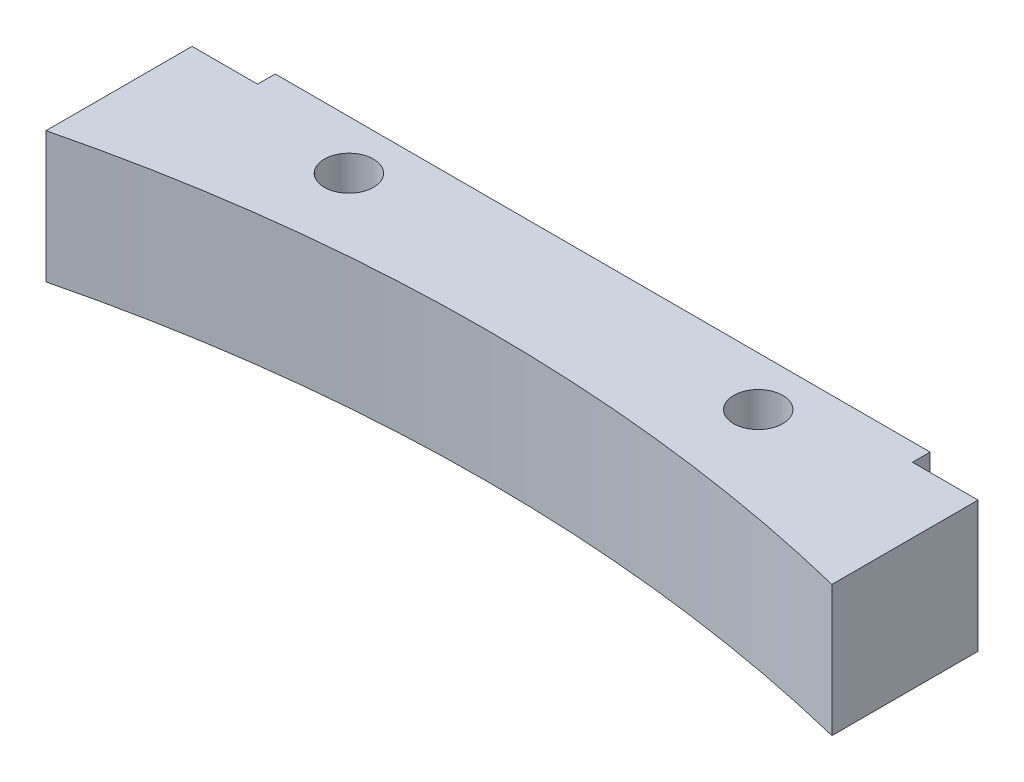
ISO-10303-21;
HEADER;
FILE_DESCRIPTION(('STEP AP214'),'2;1');
FILE_NAME('part.step','',(''),(''),'','','');
FILE_SCHEMA(('AUTOMOTIVE_DESIGN { 1 0 10303 214 1 1 1 1 }'));
ENDSEC;
DATA;
#1=APPLICATION_CONTEXT('core data for automotive mechanical design processes');
#2=APPLICATION_PROTOCOL_DEFINITION('international standard','automotive_design',2000,#1);
#3=PRODUCT_CONTEXT('',#1,'mechanical');
#4=PRODUCT('Part','Part','',(#3));
#5=PRODUCT_RELATED_PRODUCT_CATEGORY('part','',(#4));
#6=PRODUCT_DEFINITION_FORMATION('','',#4);
#7=PRODUCT_DEFINITION_CONTEXT('part definition',#1,'design');
#8=PRODUCT_DEFINITION('design','',#6,#7);
#9=PRODUCT_DEFINITION_SHAPE('','',#8);
#10=(LENGTH_UNIT() NAMED_UNIT(*) SI_UNIT(.MILLI.,.METRE.));
#11=(NAMED_UNIT(*) PLANE_ANGLE_UNIT() SI_UNIT($,.RADIAN.));
#12=(NAMED_UNIT(*) SI_UNIT($,.STERADIAN.) SOLID_ANGLE_UNIT());
#13=UNCERTAINTY_MEASURE_WITH_UNIT(LENGTH_MEASURE(1.E-05),#10,'distance_accuracy_value','');
#14=(GEOMETRIC_REPRESENTATION_CONTEXT(3) GLOBAL_UNCERTAINTY_ASSIGNED_CONTEXT((#13)) GLOBAL_UNIT_ASSIGNED_CONTEXT((#10,
#11,#12)) REPRESENTATION_CONTEXT('',''));
#15=CARTESIAN_POINT('',(0.,0.,0.));
#16=DIRECTION('',(0.,0.,1.));
#17=DIRECTION('',(1.,0.,0.));
#18=AXIS2_PLACEMENT_3D('',#15,#16,#17);
#19=CARTESIAN_POINT('',(-20.,4.,0.));
#20=DIRECTION('',(1.,0.,0.));
#21=DIRECTION('',(0.,0.,-1.));
#22=AXIS2_PLACEMENT_3D('',#19,#20,#21);
#23=PLANE('',#22);
#24=DIRECTION('',(0.,0.,1.));
#25=VECTOR('',#24,1.);
#26=CARTESIAN_POINT('',(-20.,4.,0.));
#27=LINE('',#26,#25);
#28=CARTESIAN_POINT('',(-20.,4.,6.9227112039072));
#29=VERTEX_POINT('',#28);
#30=CARTESIAN_POINT('',(-20.,4.,8.));
#31=VERTEX_POINT('',#30);
#32=EDGE_CURVE('E101',#29,#31,#27,.T.);
#33=ORIENTED_EDGE('',*,*,#32,.F.);
#34=DIRECTION('',(0.,1.,0.));
#35=VECTOR('',#34,1.);
#36=CARTESIAN_POINT('',(-20.,-4.,6.9227112039072));
#37=LINE('',#36,#35);
#38=CARTESIAN_POINT('',(-20.,-4.,6.9227112039072));
#39=VERTEX_POINT('',#38);
#40=EDGE_CURVE('E180',#39,#29,#37,.T.);
#41=ORIENTED_EDGE('',*,*,#40,.F.);
#42=DIRECTION('',(0.,0.,1.));
#43=VECTOR('',#42,1.);
#44=CARTESIAN_POINT('',(-20.,-4.,0.));
#45=LINE('',#44,#43);
#46=CARTESIAN_POINT('',(-20.,-4.,8.));
#47=VERTEX_POINT('',#46);
#48=EDGE_CURVE('E142',#39,#47,#45,.T.);
#49=ORIENTED_EDGE('',*,*,#48,.T.);
#50=DIRECTION('',(0.,-1.,0.));
#51=VECTOR('',#50,1.);
#52=CARTESIAN_POINT('',(-20.,4.,8.));
#53=LINE('',#52,#51);
#54=EDGE_CURVE('E11',#31,#47,#53,.T.);
#55=ORIENTED_EDGE('',*,*,#54,.F.);
#56=EDGE_LOOP('',(#33,#41,#49,#55));
#57=FACE_BOUND('',#56,.T.);
#58=ADVANCED_FACE('F43',(#57),#23,.F.);
#59=CARTESIAN_POINT('',(-20.,4.,8.));
#60=DIRECTION('',(0.,0.,1.));
#61=DIRECTION('',(1.,0.,0.));
#62=AXIS2_PLACEMENT_3D('',#59,#60,#61);
#63=PLANE('',#62);
#64=DIRECTION('',(-1.,0.,0.));
#65=VECTOR('',#64,1.);
#66=CARTESIAN_POINT('',(-20.,-4.,8.));
#67=LINE('',#66,#65);
#68=CARTESIAN_POINT('',(-24.,-4.,8.));
#69=VERTEX_POINT('',#68);
#70=EDGE_CURVE('E144',#47,#69,#67,.T.);
#71=ORIENTED_EDGE('',*,*,#70,.T.);
#72=DIRECTION('',(0.,-1.,0.));
#73=VECTOR('',#72,1.);
#74=CARTESIAN_POINT('',(-24.,4.,8.));
#75=LINE('',#74,#73);
#76=CARTESIAN_POINT('',(-24.,4.,8.));
#77=VERTEX_POINT('',#76);
#78=EDGE_CURVE('E50',#77,#69,#75,.T.);
#79=ORIENTED_EDGE('',*,*,#78,.F.);
#80=DIRECTION('',(-1.,0.,0.));
#81=VECTOR('',#80,1.);
#82=CARTESIAN_POINT('',(-20.,4.,8.));
#83=LINE('',#82,#81);
#84=EDGE_CURVE('E197',#31,#77,#83,.T.);
#85=ORIENTED_EDGE('',*,*,#84,.F.);
#86=ORIENTED_EDGE('',*,*,#54,.T.);
#87=EDGE_LOOP('',(#71,#79,#85,#86));
#88=FACE_BOUND('',#87,.T.);
#89=ADVANCED_FACE('F198',(#88),#63,.F.);
#90=CARTESIAN_POINT('',(-24.,4.,8.));
#91=DIRECTION('',(1.,0.,0.));
#92=DIRECTION('',(0.,0.,-1.));
#93=AXIS2_PLACEMENT_3D('',#90,#91,#92);
#94=PLANE('',#93);
#95=DIRECTION('',(0.,0.,1.));
#96=VECTOR('',#95,1.);
#97=CARTESIAN_POINT('',(-24.,-4.,8.));
#98=LINE('',#97,#96);
#99=CARTESIAN_POINT('',(-24.,-4.,16.9227112039072));
#100=VERTEX_POINT('',#99);
#101=EDGE_CURVE('E147',#69,#100,#98,.T.);
#102=ORIENTED_EDGE('',*,*,#101,.T.);
#103=DIRECTION('',(0.,-1.,0.));
#104=VECTOR('',#103,1.);
#105=CARTESIAN_POINT('',(-24.,4.,16.9227112039072));
#106=LINE('',#105,#104);
#107=CARTESIAN_POINT('',(-24.,4.,16.9227112039072));
#108=VERTEX_POINT('',#107);
#109=EDGE_CURVE('E131',#108,#100,#106,.T.);
#110=ORIENTED_EDGE('',*,*,#109,.F.);
#111=DIRECTION('',(0.,0.,1.));
#112=VECTOR('',#111,1.);
#113=CARTESIAN_POINT('',(-24.,4.,8.));
#114=LINE('',#113,#112);
#115=EDGE_CURVE('E119',#77,#108,#114,.T.);
#116=ORIENTED_EDGE('',*,*,#115,.F.);
#117=ORIENTED_EDGE('',*,*,#78,.T.);
#118=EDGE_LOOP('',(#102,#110,#116,#117));
#119=FACE_BOUND('',#118,.T.);
#120=ADVANCED_FACE('F162',(#119),#94,.F.);
#121=CARTESIAN_POINT('',(0.,4.,114.));
#122=DIRECTION('',(0.,-1.,0.));
#123=DIRECTION('',(0.,0.,-1.));
#124=AXIS2_PLACEMENT_3D('',#121,#122,#123);
#125=CYLINDRICAL_SURFACE('',#124,100.);
#126=CARTESIAN_POINT('',(0.,-4.,114.));
#127=DIRECTION('',(0.,-1.,0.));
#128=DIRECTION('',(0.,0.,-1.));
#129=AXIS2_PLACEMENT_3D('',#126,#127,#128);
#130=CIRCLE('',#129,100.);
#131=CARTESIAN_POINT('',(24.,-4.,16.9227112039072));
#132=VERTEX_POINT('',#131);
#133=EDGE_CURVE('E128',#100,#132,#130,.T.);
#134=ORIENTED_EDGE('',*,*,#133,.T.);
#135=DIRECTION('',(0.,-1.,0.));
#136=VECTOR('',#135,1.);
#137=CARTESIAN_POINT('',(24.,4.,16.9227112039072));
#138=LINE('',#137,#136);
#139=CARTESIAN_POINT('',(24.,4.,16.9227112039072));
#140=VERTEX_POINT('',#139);
#141=EDGE_CURVE('E125',#140,#132,#138,.T.);
#142=ORIENTED_EDGE('',*,*,#141,.F.);
#143=CARTESIAN_POINT('',(0.,4.,114.));
#144=DIRECTION('',(0.,-1.,0.));
#145=DIRECTION('',(0.,0.,-1.));
#146=AXIS2_PLACEMENT_3D('',#143,#144,#145);
#147=CIRCLE('',#146,100.);
#148=EDGE_CURVE('E112',#108,#140,#147,.T.);
#149=ORIENTED_EDGE('',*,*,#148,.F.);
#150=ORIENTED_EDGE('',*,*,#109,.T.);
#151=EDGE_LOOP('',(#134,#142,#149,#150));
#152=FACE_BOUND('',#151,.T.);
#153=ADVANCED_FACE('F126',(#152),#125,.F.);
#154=CARTESIAN_POINT('',(24.,4.,8.));
#155=DIRECTION('',(-1.,0.,0.));
#156=DIRECTION('',(0.,0.,1.));
#157=AXIS2_PLACEMENT_3D('',#154,#155,#156);
#158=PLANE('',#157);
#159=DIRECTION('',(0.,0.,-1.));
#160=VECTOR('',#159,1.);
#161=CARTESIAN_POINT('',(24.,-4.,8.));
#162=LINE('',#161,#160);
#163=CARTESIAN_POINT('',(24.,-4.,8.));
#164=VERTEX_POINT('',#163);
#165=EDGE_CURVE('E150',#132,#164,#162,.T.);
#166=ORIENTED_EDGE('',*,*,#165,.T.);
#167=DIRECTION('',(0.,-1.,0.));
#168=VECTOR('',#167,1.);
#169=CARTESIAN_POINT('',(24.,4.,8.));
#170=LINE('',#169,#168);
#171=CARTESIAN_POINT('',(24.,4.,8.));
#172=VERTEX_POINT('',#171);
#173=EDGE_CURVE('E132',#172,#164,#170,.T.);
#174=ORIENTED_EDGE('',*,*,#173,.F.);
#175=DIRECTION('',(0.,0.,-1.));
#176=VECTOR('',#175,1.);
#177=CARTESIAN_POINT('',(24.,4.,8.));
#178=LINE('',#177,#176);
#179=EDGE_CURVE('E116',#140,#172,#178,.T.);
#180=ORIENTED_EDGE('',*,*,#179,.F.);
#181=ORIENTED_EDGE('',*,*,#141,.T.);
#182=EDGE_LOOP('',(#166,#174,#180,#181));
#183=FACE_BOUND('',#182,.T.);
#184=ADVANCED_FACE('F134',(#183),#158,.F.);
#185=CARTESIAN_POINT('',(20.,4.,8.));
#186=DIRECTION('',(0.,0.,1.));
#187=DIRECTION('',(1.,0.,0.));
#188=AXIS2_PLACEMENT_3D('',#185,#186,#187);
#189=PLANE('',#188);
#190=DIRECTION('',(-1.,0.,0.));
#191=VECTOR('',#190,1.);
#192=CARTESIAN_POINT('',(20.,-4.,8.));
#193=LINE('',#192,#191);
#194=CARTESIAN_POINT('',(20.,-4.,8.));
#195=VERTEX_POINT('',#194);
#196=EDGE_CURVE('E93',#164,#195,#193,.T.);
#197=ORIENTED_EDGE('',*,*,#196,.T.);
#198=DIRECTION('',(0.,-1.,0.));
#199=VECTOR('',#198,1.);
#200=CARTESIAN_POINT('',(20.,4.,8.));
#201=LINE('',#200,#199);
#202=CARTESIAN_POINT('',(20.,4.,8.));
#203=VERTEX_POINT('',#202);
#204=EDGE_CURVE('E141',#203,#195,#201,.T.);
#205=ORIENTED_EDGE('',*,*,#204,.F.);
#206=DIRECTION('',(-1.,0.,0.));
#207=VECTOR('',#206,1.);
#208=CARTESIAN_POINT('',(20.,4.,8.));
#209=LINE('',#208,#207);
#210=EDGE_CURVE('E66',#172,#203,#209,.T.);
#211=ORIENTED_EDGE('',*,*,#210,.F.);
#212=ORIENTED_EDGE('',*,*,#173,.T.);
#213=EDGE_LOOP('',(#197,#205,#211,#212));
#214=FACE_BOUND('',#213,.T.);
#215=ADVANCED_FACE('F171',(#214),#189,.F.);
#216=CARTESIAN_POINT('',(20.,4.,0.));
#217=DIRECTION('',(-1.,0.,0.));
#218=DIRECTION('',(0.,0.,1.));
#219=AXIS2_PLACEMENT_3D('',#216,#217,#218);
#220=PLANE('',#219);
#221=DIRECTION('',(0.,0.,-1.));
#222=VECTOR('',#221,1.);
#223=CARTESIAN_POINT('',(20.,-4.,0.));
#224=LINE('',#223,#222);
#225=CARTESIAN_POINT('',(20.,-4.,6.92271120390721));
#226=VERTEX_POINT('',#225);
#227=EDGE_CURVE('E153',#195,#226,#224,.T.);
#228=ORIENTED_EDGE('',*,*,#227,.T.);
#229=DIRECTION('',(0.,1.,0.));
#230=VECTOR('',#229,1.);
#231=CARTESIAN_POINT('',(20.,-4.,6.9227112039072));
#232=LINE('',#231,#230);
#233=CARTESIAN_POINT('',(20.,4.,6.9227112039072));
#234=VERTEX_POINT('',#233);
#235=EDGE_CURVE('E57',#226,#234,#232,.T.);
#236=ORIENTED_EDGE('',*,*,#235,.T.);
#237=DIRECTION('',(0.,0.,-1.));
#238=VECTOR('',#237,1.);
#239=CARTESIAN_POINT('',(20.,4.,0.));
#240=LINE('',#239,#238);
#241=EDGE_CURVE('E136',#203,#234,#240,.T.);
#242=ORIENTED_EDGE('',*,*,#241,.F.);
#243=ORIENTED_EDGE('',*,*,#204,.T.);
#244=EDGE_LOOP('',(#228,#236,#242,#243));
#245=FACE_BOUND('',#244,.T.);
#246=ADVANCED_FACE('F174',(#245),#220,.F.);
#247=CARTESIAN_POINT('',(0.,4.,114.));
#248=DIRECTION('',(0.,-1.,0.));
#249=DIRECTION('',(0.,0.,-1.));
#250=AXIS2_PLACEMENT_3D('',#247,#248,#249);
#251=PLANE('',#250);
#252=CARTESIAN_POINT('',(12.5,4.,9.9227112039072));
#253=DIRECTION('',(0.,1.,0.));
#254=DIRECTION('',(0.,0.,1.));
#255=AXIS2_PLACEMENT_3D('',#252,#253,#254);
#256=CIRCLE('',#255,1.5);
#257=CARTESIAN_POINT('',(12.5,4.,11.4227112039072));
#258=VERTEX_POINT('',#257);
#259=EDGE_CURVE('E185',#258,#258,#256,.T.);
#260=ORIENTED_EDGE('',*,*,#259,.F.);
#261=EDGE_LOOP('',(#260));
#262=FACE_BOUND('',#261,.T.);
#263=CARTESIAN_POINT('',(-12.5,4.,9.9227112039072));
#264=DIRECTION('',(0.,1.,0.));
#265=DIRECTION('',(0.,0.,1.));
#266=AXIS2_PLACEMENT_3D('',#263,#264,#265);
#267=CIRCLE('',#266,1.5);
#268=CARTESIAN_POINT('',(-12.5,4.,11.4227112039072));
#269=VERTEX_POINT('',#268);
#270=EDGE_CURVE('E192',#269,#269,#267,.T.);
#271=ORIENTED_EDGE('',*,*,#270,.F.);
#272=EDGE_LOOP('',(#271));
#273=FACE_BOUND('',#272,.T.);
#274=ORIENTED_EDGE('',*,*,#241,.T.);
#275=DIRECTION('',(1.,0.,0.));
#276=VECTOR('',#275,1.);
#277=CARTESIAN_POINT('',(0.,4.,6.9227112039072));
#278=LINE('',#277,#276);
#279=EDGE_CURVE('E176',#29,#234,#278,.T.);
#280=ORIENTED_EDGE('',*,*,#279,.F.);
#281=ORIENTED_EDGE('',*,*,#32,.T.);
#282=ORIENTED_EDGE('',*,*,#84,.T.);
#283=ORIENTED_EDGE('',*,*,#115,.T.);
#284=ORIENTED_EDGE('',*,*,#148,.T.);
#285=ORIENTED_EDGE('',*,*,#179,.T.);
#286=ORIENTED_EDGE('',*,*,#210,.T.);
#287=EDGE_LOOP('',(#274,#280,#281,#282,#283,#284,#285,#286));
#288=FACE_BOUND('',#287,.T.);
#289=ADVANCED_FACE('F114',(#262,#273,#288),#251,.F.);
#290=CARTESIAN_POINT('',(0.,-4.,114.));
#291=DIRECTION('',(0.,-1.,0.));
#292=DIRECTION('',(0.,0.,-1.));
#293=AXIS2_PLACEMENT_3D('',#290,#291,#292);
#294=PLANE('',#293);
#295=DIRECTION('',(1.,0.,0.));
#296=VECTOR('',#295,1.);
#297=CARTESIAN_POINT('',(0.,-4.,6.9227112039072));
#298=LINE('',#297,#296);
#299=EDGE_CURVE('E182',#39,#226,#298,.T.);
#300=ORIENTED_EDGE('',*,*,#299,.T.);
#301=ORIENTED_EDGE('',*,*,#227,.F.);
#302=ORIENTED_EDGE('',*,*,#196,.F.);
#303=ORIENTED_EDGE('',*,*,#165,.F.);
#304=ORIENTED_EDGE('',*,*,#133,.F.);
#305=ORIENTED_EDGE('',*,*,#101,.F.);
#306=ORIENTED_EDGE('',*,*,#70,.F.);
#307=ORIENTED_EDGE('',*,*,#48,.F.);
#308=EDGE_LOOP('',(#300,#301,#302,#303,#304,#305,#306,#307));
#309=FACE_BOUND('',#308,.T.);
#310=CARTESIAN_POINT('',(12.5,-4.,9.9227112039072));
#311=DIRECTION('',(0.,1.,0.));
#312=DIRECTION('',(0.,0.,1.));
#313=AXIS2_PLACEMENT_3D('',#310,#311,#312);
#314=CIRCLE('',#313,1.5);
#315=CARTESIAN_POINT('',(12.5,-4.,11.4227112039072));
#316=VERTEX_POINT('',#315);
#317=EDGE_CURVE('E195',#316,#316,#314,.T.);
#318=ORIENTED_EDGE('',*,*,#317,.T.);
#319=EDGE_LOOP('',(#318));
#320=FACE_BOUND('',#319,.T.);
#321=CARTESIAN_POINT('',(-12.5,-4.,9.9227112039072));
#322=DIRECTION('',(0.,1.,0.));
#323=DIRECTION('',(0.,0.,1.));
#324=AXIS2_PLACEMENT_3D('',#321,#322,#323);
#325=CIRCLE('',#324,1.5);
#326=CARTESIAN_POINT('',(-12.5,-4.,11.4227112039072));
#327=VERTEX_POINT('',#326);
#328=EDGE_CURVE('E145',#327,#327,#325,.T.);
#329=ORIENTED_EDGE('',*,*,#328,.T.);
#330=EDGE_LOOP('',(#329));
#331=FACE_BOUND('',#330,.T.);
#332=ADVANCED_FACE('F167',(#309,#320,#331),#294,.T.);
#333=CARTESIAN_POINT('',(-12.5,-4.,9.9227112039072));
#334=DIRECTION('',(0.,1.,0.));
#335=DIRECTION('',(0.,0.,1.));
#336=AXIS2_PLACEMENT_3D('',#333,#334,#335);
#337=CYLINDRICAL_SURFACE('',#336,1.5);
#338=ORIENTED_EDGE('',*,*,#328,.F.);
#339=EDGE_LOOP('',(#338));
#340=FACE_BOUND('',#339,.T.);
#341=ORIENTED_EDGE('',*,*,#270,.T.);
#342=EDGE_LOOP('',(#341));
#343=FACE_BOUND('',#342,.T.);
#344=ADVANCED_FACE('F218',(#340,#343),#337,.F.);
#345=CARTESIAN_POINT('',(12.5,-4.,9.9227112039072));
#346=DIRECTION('',(0.,1.,0.));
#347=DIRECTION('',(0.,0.,1.));
#348=AXIS2_PLACEMENT_3D('',#345,#346,#347);
#349=CYLINDRICAL_SURFACE('',#348,1.5);
#350=ORIENTED_EDGE('',*,*,#317,.F.);
#351=EDGE_LOOP('',(#350));
#352=FACE_BOUND('',#351,.T.);
#353=ORIENTED_EDGE('',*,*,#259,.T.);
#354=EDGE_LOOP('',(#353));
#355=FACE_BOUND('',#354,.T.);
#356=ADVANCED_FACE('F224',(#352,#355),#349,.F.);
#357=CARTESIAN_POINT('',(0.,-4.,6.9227112039072));
#358=DIRECTION('',(0.,0.,1.));
#359=DIRECTION('',(1.,0.,0.));
#360=AXIS2_PLACEMENT_3D('',#357,#358,#359);
#361=PLANE('',#360);
#362=ORIENTED_EDGE('',*,*,#279,.T.);
#363=ORIENTED_EDGE('',*,*,#235,.F.);
#364=ORIENTED_EDGE('',*,*,#299,.F.);
#365=ORIENTED_EDGE('',*,*,#40,.T.);
#366=EDGE_LOOP('',(#362,#363,#364,#365));
#367=FACE_BOUND('',#366,.T.);
#368=ADVANCED_FACE('F181',(#367),#361,.F.);
#369=CLOSED_SHELL('',(#58,#89,#120,#153,#184,#215,#246,#289,#332,#344,#356,#368));
#370=MANIFOLD_SOLID_BREP('B2',#369);
#371=ADVANCED_BREP_SHAPE_REPRESENTATION('',(#18,#370),#14);
#372=SHAPE_DEFINITION_REPRESENTATION(#9,#371);
ENDSEC;
END-ISO-10303-21;
